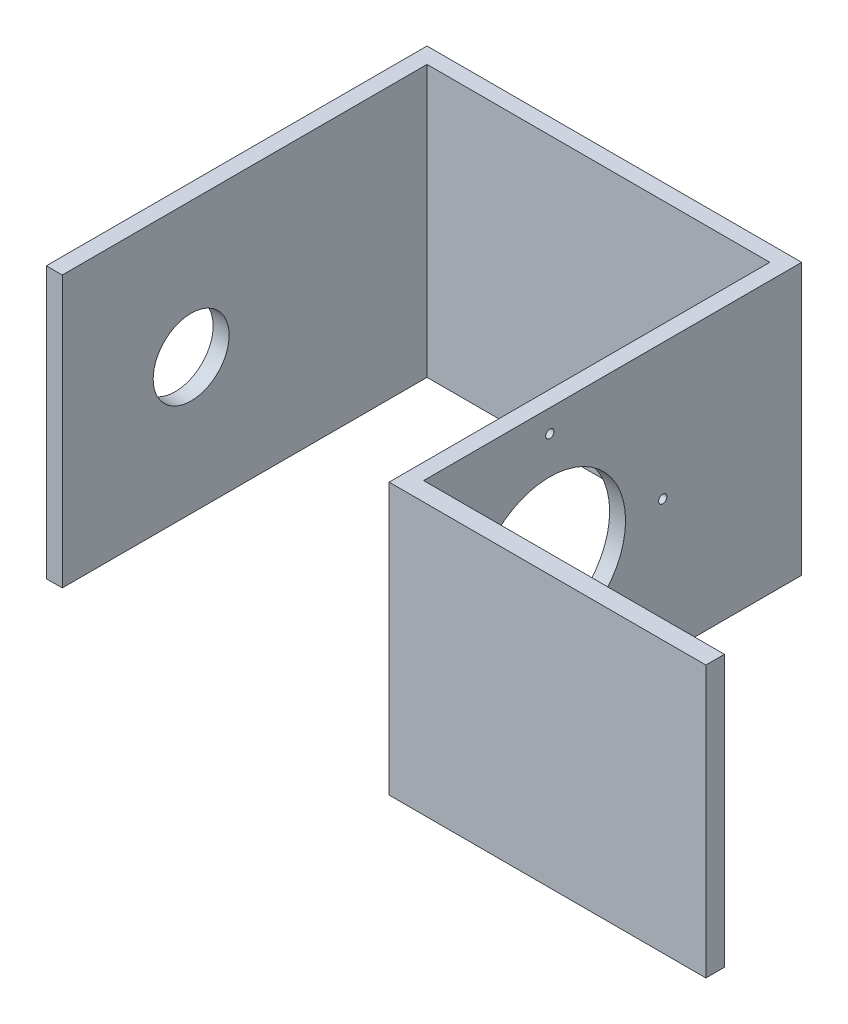
ISO-10303-21;
HEADER;
FILE_DESCRIPTION(('STEP AP214'),'2;1');
FILE_NAME('part.step','',(''),(''),'','','');
FILE_SCHEMA(('AUTOMOTIVE_DESIGN { 1 0 10303 214 1 1 1 1 }'));
ENDSEC;
DATA;
#1=APPLICATION_CONTEXT('core data for automotive mechanical design processes');
#2=APPLICATION_PROTOCOL_DEFINITION('international standard','automotive_design',2000,#1);
#3=PRODUCT_CONTEXT('',#1,'mechanical');
#4=PRODUCT('Part','Part','',(#3));
#5=PRODUCT_RELATED_PRODUCT_CATEGORY('part','',(#4));
#6=PRODUCT_DEFINITION_FORMATION('','',#4);
#7=PRODUCT_DEFINITION_CONTEXT('part definition',#1,'design');
#8=PRODUCT_DEFINITION('design','',#6,#7);
#9=PRODUCT_DEFINITION_SHAPE('','',#8);
#10=(LENGTH_UNIT() NAMED_UNIT(*) SI_UNIT(.MILLI.,.METRE.));
#11=(NAMED_UNIT(*) PLANE_ANGLE_UNIT() SI_UNIT($,.RADIAN.));
#12=(NAMED_UNIT(*) SI_UNIT($,.STERADIAN.) SOLID_ANGLE_UNIT());
#13=UNCERTAINTY_MEASURE_WITH_UNIT(LENGTH_MEASURE(1.E-05),#10,'distance_accuracy_value','');
#14=(GEOMETRIC_REPRESENTATION_CONTEXT(3) GLOBAL_UNCERTAINTY_ASSIGNED_CONTEXT((#13)) GLOBAL_UNIT_ASSIGNED_CONTEXT((#10,
#11,#12)) REPRESENTATION_CONTEXT('',''));
#15=CARTESIAN_POINT('',(0.,0.,0.));
#16=DIRECTION('',(0.,0.,1.));
#17=DIRECTION('',(1.,0.,0.));
#18=AXIS2_PLACEMENT_3D('',#15,#16,#17);
#19=CARTESIAN_POINT('',(183.723,51.,0.));
#20=DIRECTION('',(1.,0.,0.));
#21=DIRECTION('',(0.,0.,-1.));
#22=AXIS2_PLACEMENT_3D('',#19,#20,#21);
#23=PLANE('',#22);
#24=DIRECTION('',(0.,-1.,0.));
#25=VECTOR('',#24,1.);
#26=CARTESIAN_POINT('',(183.723,51.,54.5));
#27=LINE('',#26,#25);
#28=CARTESIAN_POINT('',(183.723,51.,54.5));
#29=VERTEX_POINT('',#28);
#30=CARTESIAN_POINT('',(183.723,-51.,54.5));
#31=VERTEX_POINT('',#30);
#32=EDGE_CURVE('E132',#29,#31,#27,.T.);
#33=ORIENTED_EDGE('',*,*,#32,.T.);
#34=DIRECTION('',(0.,0.,1.));
#35=VECTOR('',#34,1.);
#36=CARTESIAN_POINT('',(183.723,-51.,0.));
#37=LINE('',#36,#35);
#38=CARTESIAN_POINT('',(183.723,-51.,47.5));
#39=VERTEX_POINT('',#38);
#40=EDGE_CURVE('E131',#39,#31,#37,.T.);
#41=ORIENTED_EDGE('',*,*,#40,.F.);
#42=DIRECTION('',(0.,-1.,0.));
#43=VECTOR('',#42,1.);
#44=CARTESIAN_POINT('',(183.723,51.,47.5));
#45=LINE('',#44,#43);
#46=CARTESIAN_POINT('',(183.723,51.,47.5));
#47=VERTEX_POINT('',#46);
#48=EDGE_CURVE('E11',#47,#39,#45,.T.);
#49=ORIENTED_EDGE('',*,*,#48,.F.);
#50=DIRECTION('',(0.,0.,1.));
#51=VECTOR('',#50,1.);
#52=CARTESIAN_POINT('',(183.723,51.,0.));
#53=LINE('',#52,#51);
#54=EDGE_CURVE('E177',#47,#29,#53,.T.);
#55=ORIENTED_EDGE('',*,*,#54,.T.);
#56=EDGE_LOOP('',(#33,#41,#49,#55));
#57=FACE_BOUND('',#56,.T.);
#58=ADVANCED_FACE('F45',(#57),#23,.T.);
#59=CARTESIAN_POINT('',(0.,51.,47.5));
#60=DIRECTION('',(0.,0.,1.));
#61=DIRECTION('',(1.,0.,0.));
#62=AXIS2_PLACEMENT_3D('',#59,#60,#61);
#63=PLANE('',#62);
#64=ORIENTED_EDGE('',*,*,#48,.T.);
#65=DIRECTION('',(-1.,0.,0.));
#66=VECTOR('',#65,1.);
#67=CARTESIAN_POINT('',(0.,-51.,47.5));
#68=LINE('',#67,#66);
#69=CARTESIAN_POINT('',(70.5,-51.,47.5));
#70=VERTEX_POINT('',#69);
#71=EDGE_CURVE('E126',#39,#70,#68,.T.);
#72=ORIENTED_EDGE('',*,*,#71,.T.);
#73=DIRECTION('',(0.,-1.,0.));
#74=VECTOR('',#73,1.);
#75=CARTESIAN_POINT('',(70.5,51.,47.5));
#76=LINE('',#75,#74);
#77=CARTESIAN_POINT('',(70.5,51.,47.5));
#78=VERTEX_POINT('',#77);
#79=EDGE_CURVE('E53',#78,#70,#76,.T.);
#80=ORIENTED_EDGE('',*,*,#79,.F.);
#81=DIRECTION('',(-1.,0.,0.));
#82=VECTOR('',#81,1.);
#83=CARTESIAN_POINT('',(0.,51.,47.5));
#84=LINE('',#83,#82);
#85=EDGE_CURVE('E127',#47,#78,#84,.T.);
#86=ORIENTED_EDGE('',*,*,#85,.F.);
#87=EDGE_LOOP('',(#64,#72,#80,#86));
#88=FACE_BOUND('',#87,.T.);
#89=ADVANCED_FACE('F123',(#88),#63,.F.);
#90=CARTESIAN_POINT('',(70.5,51.,0.));
#91=DIRECTION('',(1.,0.,0.));
#92=DIRECTION('',(0.,0.,-1.));
#93=AXIS2_PLACEMENT_3D('',#90,#91,#92);
#94=PLANE('',#93);
#95=CARTESIAN_POINT('',(70.5,42.5,0.));
#96=DIRECTION('',(1.,0.,0.));
#97=DIRECTION('',(0.,0.,-1.));
#98=AXIS2_PLACEMENT_3D('',#95,#96,#97);
#99=CIRCLE('',#98,1.5635);
#100=CARTESIAN_POINT('',(70.5,42.5,-1.56350000000001));
#101=VERTEX_POINT('',#100);
#102=EDGE_CURVE('E423',#101,#101,#99,.T.);
#103=ORIENTED_EDGE('',*,*,#102,.F.);
#104=EDGE_LOOP('',(#103));
#105=FACE_BOUND('',#104,.T.);
#106=CARTESIAN_POINT('',(70.5,0.,42.5));
#107=DIRECTION('',(1.,0.,0.));
#108=DIRECTION('',(0.,0.,-1.));
#109=AXIS2_PLACEMENT_3D('',#106,#107,#108);
#110=CIRCLE('',#109,1.5635);
#111=CARTESIAN_POINT('',(70.5,0.,40.9365));
#112=VERTEX_POINT('',#111);
#113=EDGE_CURVE('E428',#112,#112,#110,.T.);
#114=ORIENTED_EDGE('',*,*,#113,.F.);
#115=EDGE_LOOP('',(#114));
#116=FACE_BOUND('',#115,.T.);
#117=CARTESIAN_POINT('',(70.5,-42.5,0.));
#118=DIRECTION('',(1.,0.,0.));
#119=DIRECTION('',(0.,0.,-1.));
#120=AXIS2_PLACEMENT_3D('',#117,#118,#119);
#121=CIRCLE('',#120,1.5635);
#122=CARTESIAN_POINT('',(70.5,-42.5,-1.56350000000001));
#123=VERTEX_POINT('',#122);
#124=EDGE_CURVE('E433',#123,#123,#121,.T.);
#125=ORIENTED_EDGE('',*,*,#124,.F.);
#126=EDGE_LOOP('',(#125));
#127=FACE_BOUND('',#126,.T.);
#128=CARTESIAN_POINT('',(70.5,0.,-42.5));
#129=DIRECTION('',(1.,0.,0.));
#130=DIRECTION('',(0.,0.,-1.));
#131=AXIS2_PLACEMENT_3D('',#128,#129,#130);
#132=CIRCLE('',#131,1.5635);
#133=CARTESIAN_POINT('',(70.5,0.,-44.0635));
#134=VERTEX_POINT('',#133);
#135=EDGE_CURVE('E419',#134,#134,#132,.T.);
#136=ORIENTED_EDGE('',*,*,#135,.F.);
#137=EDGE_LOOP('',(#136));
#138=FACE_BOUND('',#137,.T.);
#139=CARTESIAN_POINT('',(70.5,0.,0.));
#140=DIRECTION('',(1.,0.,0.));
#141=DIRECTION('',(0.,0.,-1.));
#142=AXIS2_PLACEMENT_3D('',#139,#140,#141);
#143=CIRCLE('',#142,28.5);
#144=CARTESIAN_POINT('',(70.5,0.,-28.5));
#145=VERTEX_POINT('',#144);
#146=EDGE_CURVE('E413',#145,#145,#143,.T.);
#147=ORIENTED_EDGE('',*,*,#146,.F.);
#148=EDGE_LOOP('',(#147));
#149=FACE_BOUND('',#148,.T.);
#150=ORIENTED_EDGE('',*,*,#79,.T.);
#151=DIRECTION('',(0.,0.,1.));
#152=VECTOR('',#151,1.);
#153=CARTESIAN_POINT('',(70.5,-51.,0.));
#154=LINE('',#153,#152);
#155=CARTESIAN_POINT('',(70.5,-51.,-94.7730618060092));
#156=VERTEX_POINT('',#155);
#157=EDGE_CURVE('E143',#156,#70,#154,.T.);
#158=ORIENTED_EDGE('',*,*,#157,.F.);
#159=DIRECTION('',(0.,-1.,0.));
#160=VECTOR('',#159,1.);
#161=CARTESIAN_POINT('',(70.5,51.,-94.7730618060092));
#162=LINE('',#161,#160);
#163=CARTESIAN_POINT('',(70.5,51.,-94.7730618060092));
#164=VERTEX_POINT('',#163);
#165=EDGE_CURVE('E229',#164,#156,#162,.T.);
#166=ORIENTED_EDGE('',*,*,#165,.F.);
#167=DIRECTION('',(0.,0.,1.));
#168=VECTOR('',#167,1.);
#169=CARTESIAN_POINT('',(70.5,51.,0.));
#170=LINE('',#169,#168);
#171=EDGE_CURVE('E182',#164,#78,#170,.T.);
#172=ORIENTED_EDGE('',*,*,#171,.T.);
#173=EDGE_LOOP('',(#150,#158,#166,#172));
#174=FACE_BOUND('',#173,.T.);
#175=ADVANCED_FACE('F233',(#105,#116,#127,#138,#149,#174),#94,.T.);
#176=CARTESIAN_POINT('',(0.,51.,-94.7730618060092));
#177=DIRECTION('',(0.,0.,1.));
#178=DIRECTION('',(1.,0.,0.));
#179=AXIS2_PLACEMENT_3D('',#176,#177,#178);
#180=PLANE('',#179);
#181=ORIENTED_EDGE('',*,*,#165,.T.);
#182=DIRECTION('',(-1.,0.,0.));
#183=VECTOR('',#182,1.);
#184=CARTESIAN_POINT('',(0.,-51.,-94.7730618060092));
#185=LINE('',#184,#183);
#186=CARTESIAN_POINT('',(-70.5,-51.,-94.7730618060092));
#187=VERTEX_POINT('',#186);
#188=EDGE_CURVE('E147',#156,#187,#185,.T.);
#189=ORIENTED_EDGE('',*,*,#188,.T.);
#190=DIRECTION('',(0.,-1.,0.));
#191=VECTOR('',#190,1.);
#192=CARTESIAN_POINT('',(-70.5,51.,-94.7730618060092));
#193=LINE('',#192,#191);
#194=CARTESIAN_POINT('',(-70.5,51.,-94.7730618060092));
#195=VERTEX_POINT('',#194);
#196=EDGE_CURVE('E226',#195,#187,#193,.T.);
#197=ORIENTED_EDGE('',*,*,#196,.F.);
#198=DIRECTION('',(-1.,0.,0.));
#199=VECTOR('',#198,1.);
#200=CARTESIAN_POINT('',(0.,51.,-94.7730618060092));
#201=LINE('',#200,#199);
#202=EDGE_CURVE('E186',#164,#195,#201,.T.);
#203=ORIENTED_EDGE('',*,*,#202,.F.);
#204=EDGE_LOOP('',(#181,#189,#197,#203));
#205=FACE_BOUND('',#204,.T.);
#206=ADVANCED_FACE('F241',(#205),#180,.F.);
#207=CARTESIAN_POINT('',(-70.5,51.,0.));
#208=DIRECTION('',(-1.,0.,0.));
#209=DIRECTION('',(0.,0.,1.));
#210=AXIS2_PLACEMENT_3D('',#207,#208,#209);
#211=PLANE('',#210);
#212=CARTESIAN_POINT('',(-70.5,0.,0.));
#213=DIRECTION('',(-1.,0.,0.));
#214=DIRECTION('',(0.,0.,1.));
#215=AXIS2_PLACEMENT_3D('',#212,#213,#214);
#216=CIRCLE('',#215,14.2875);
#217=CARTESIAN_POINT('',(-70.5,0.,14.2875));
#218=VERTEX_POINT('',#217);
#219=EDGE_CURVE('E448',#218,#218,#216,.T.);
#220=ORIENTED_EDGE('',*,*,#219,.F.);
#221=EDGE_LOOP('',(#220));
#222=FACE_BOUND('',#221,.T.);
#223=ORIENTED_EDGE('',*,*,#196,.T.);
#224=DIRECTION('',(0.,0.,-1.));
#225=VECTOR('',#224,1.);
#226=CARTESIAN_POINT('',(-70.5,-51.,0.));
#227=LINE('',#226,#225);
#228=CARTESIAN_POINT('',(-70.5,-51.,48.5));
#229=VERTEX_POINT('',#228);
#230=EDGE_CURVE('E154',#229,#187,#227,.T.);
#231=ORIENTED_EDGE('',*,*,#230,.F.);
#232=DIRECTION('',(0.,-1.,0.));
#233=VECTOR('',#232,1.);
#234=CARTESIAN_POINT('',(-70.5,51.,48.5));
#235=LINE('',#234,#233);
#236=CARTESIAN_POINT('',(-70.5,51.,48.5));
#237=VERTEX_POINT('',#236);
#238=EDGE_CURVE('E223',#237,#229,#235,.T.);
#239=ORIENTED_EDGE('',*,*,#238,.F.);
#240=DIRECTION('',(0.,0.,-1.));
#241=VECTOR('',#240,1.);
#242=CARTESIAN_POINT('',(-70.5,51.,0.));
#243=LINE('',#242,#241);
#244=EDGE_CURVE('E189',#237,#195,#243,.T.);
#245=ORIENTED_EDGE('',*,*,#244,.T.);
#246=EDGE_LOOP('',(#223,#231,#239,#245));
#247=FACE_BOUND('',#246,.T.);
#248=ADVANCED_FACE('F244',(#222,#247),#211,.T.);
#249=CARTESIAN_POINT('',(0.,51.,48.5));
#250=DIRECTION('',(0.,0.,1.));
#251=DIRECTION('',(1.,0.,0.));
#252=AXIS2_PLACEMENT_3D('',#249,#250,#251);
#253=PLANE('',#252);
#254=ORIENTED_EDGE('',*,*,#238,.T.);
#255=DIRECTION('',(-1.,0.,0.));
#256=VECTOR('',#255,1.);
#257=CARTESIAN_POINT('',(0.,-51.,48.5));
#258=LINE('',#257,#256);
#259=CARTESIAN_POINT('',(-64.5,-51.,48.5));
#260=VERTEX_POINT('',#259);
#261=EDGE_CURVE('E158',#260,#229,#258,.T.);
#262=ORIENTED_EDGE('',*,*,#261,.F.);
#263=DIRECTION('',(0.,-1.,0.));
#264=VECTOR('',#263,1.);
#265=CARTESIAN_POINT('',(-64.5,51.,48.5));
#266=LINE('',#265,#264);
#267=CARTESIAN_POINT('',(-64.5,51.,48.5));
#268=VERTEX_POINT('',#267);
#269=EDGE_CURVE('E220',#268,#260,#266,.T.);
#270=ORIENTED_EDGE('',*,*,#269,.F.);
#271=DIRECTION('',(-1.,0.,0.));
#272=VECTOR('',#271,1.);
#273=CARTESIAN_POINT('',(0.,51.,48.5));
#274=LINE('',#273,#272);
#275=EDGE_CURVE('E193',#268,#237,#274,.T.);
#276=ORIENTED_EDGE('',*,*,#275,.T.);
#277=EDGE_LOOP('',(#254,#262,#270,#276));
#278=FACE_BOUND('',#277,.T.);
#279=ADVANCED_FACE('F247',(#278),#253,.T.);
#280=CARTESIAN_POINT('',(-64.5,51.,0.));
#281=DIRECTION('',(1.,0.,0.));
#282=DIRECTION('',(0.,0.,-1.));
#283=AXIS2_PLACEMENT_3D('',#280,#281,#282);
#284=PLANE('',#283);
#285=CARTESIAN_POINT('',(-64.5,0.,0.));
#286=DIRECTION('',(1.,0.,0.));
#287=DIRECTION('',(0.,0.,-1.));
#288=AXIS2_PLACEMENT_3D('',#285,#286,#287);
#289=CIRCLE('',#288,14.2875);
#290=CARTESIAN_POINT('',(-64.5,0.,-14.2875));
#291=VERTEX_POINT('',#290);
#292=EDGE_CURVE('E455',#291,#291,#289,.F.);
#293=ORIENTED_EDGE('',*,*,#292,.T.);
#294=EDGE_LOOP('',(#293));
#295=FACE_BOUND('',#294,.T.);
#296=ORIENTED_EDGE('',*,*,#269,.T.);
#297=DIRECTION('',(0.,0.,1.));
#298=VECTOR('',#297,1.);
#299=CARTESIAN_POINT('',(-64.5,-51.,0.));
#300=LINE('',#299,#298);
#301=CARTESIAN_POINT('',(-64.5,-51.,-88.7730618060092));
#302=VERTEX_POINT('',#301);
#303=EDGE_CURVE('E162',#302,#260,#300,.T.);
#304=ORIENTED_EDGE('',*,*,#303,.F.);
#305=DIRECTION('',(0.,-1.,0.));
#306=VECTOR('',#305,1.);
#307=CARTESIAN_POINT('',(-64.5,51.,-88.7730618060092));
#308=LINE('',#307,#306);
#309=CARTESIAN_POINT('',(-64.5,51.,-88.7730618060092));
#310=VERTEX_POINT('',#309);
#311=EDGE_CURVE('E217',#310,#302,#308,.T.);
#312=ORIENTED_EDGE('',*,*,#311,.F.);
#313=DIRECTION('',(0.,0.,1.));
#314=VECTOR('',#313,1.);
#315=CARTESIAN_POINT('',(-64.5,51.,0.));
#316=LINE('',#315,#314);
#317=EDGE_CURVE('E197',#310,#268,#316,.T.);
#318=ORIENTED_EDGE('',*,*,#317,.T.);
#319=EDGE_LOOP('',(#296,#304,#312,#318));
#320=FACE_BOUND('',#319,.T.);
#321=ADVANCED_FACE('F252',(#295,#320),#284,.T.);
#322=CARTESIAN_POINT('',(0.,51.,-88.7730618060092));
#323=DIRECTION('',(0.,0.,1.));
#324=DIRECTION('',(1.,0.,0.));
#325=AXIS2_PLACEMENT_3D('',#322,#323,#324);
#326=PLANE('',#325);
#327=ORIENTED_EDGE('',*,*,#311,.T.);
#328=DIRECTION('',(-1.,0.,0.));
#329=VECTOR('',#328,1.);
#330=CARTESIAN_POINT('',(0.,-51.,-88.7730618060092));
#331=LINE('',#330,#329);
#332=CARTESIAN_POINT('',(64.5,-51.,-88.7730618060092));
#333=VERTEX_POINT('',#332);
#334=EDGE_CURVE('E166',#333,#302,#331,.T.);
#335=ORIENTED_EDGE('',*,*,#334,.F.);
#336=DIRECTION('',(0.,-1.,0.));
#337=VECTOR('',#336,1.);
#338=CARTESIAN_POINT('',(64.5,51.,-88.7730618060092));
#339=LINE('',#338,#337);
#340=CARTESIAN_POINT('',(64.5,51.,-88.7730618060092));
#341=VERTEX_POINT('',#340);
#342=EDGE_CURVE('E214',#341,#333,#339,.T.);
#343=ORIENTED_EDGE('',*,*,#342,.F.);
#344=DIRECTION('',(-1.,0.,0.));
#345=VECTOR('',#344,1.);
#346=CARTESIAN_POINT('',(0.,51.,-88.7730618060092));
#347=LINE('',#346,#345);
#348=EDGE_CURVE('E201',#341,#310,#347,.T.);
#349=ORIENTED_EDGE('',*,*,#348,.T.);
#350=EDGE_LOOP('',(#327,#335,#343,#349));
#351=FACE_BOUND('',#350,.T.);
#352=ADVANCED_FACE('F255',(#351),#326,.T.);
#353=CARTESIAN_POINT('',(64.5,51.,0.));
#354=DIRECTION('',(1.,0.,0.));
#355=DIRECTION('',(0.,0.,-1.));
#356=AXIS2_PLACEMENT_3D('',#353,#354,#355);
#357=PLANE('',#356);
#358=CARTESIAN_POINT('',(64.5,42.5,0.));
#359=DIRECTION('',(1.,0.,0.));
#360=DIRECTION('',(0.,0.,-1.));
#361=AXIS2_PLACEMENT_3D('',#358,#359,#360);
#362=CIRCLE('',#361,1.5635);
#363=CARTESIAN_POINT('',(64.5,42.5,-1.56350000000001));
#364=VERTEX_POINT('',#363);
#365=EDGE_CURVE('E137',#364,#364,#362,.F.);
#366=ORIENTED_EDGE('',*,*,#365,.F.);
#367=EDGE_LOOP('',(#366));
#368=FACE_BOUND('',#367,.T.);
#369=CARTESIAN_POINT('',(64.5,0.,42.5));
#370=DIRECTION('',(1.,0.,0.));
#371=DIRECTION('',(0.,0.,-1.));
#372=AXIS2_PLACEMENT_3D('',#369,#370,#371);
#373=CIRCLE('',#372,1.5635);
#374=CARTESIAN_POINT('',(64.5,0.,40.9365));
#375=VERTEX_POINT('',#374);
#376=EDGE_CURVE('E445',#375,#375,#373,.F.);
#377=ORIENTED_EDGE('',*,*,#376,.F.);
#378=EDGE_LOOP('',(#377));
#379=FACE_BOUND('',#378,.T.);
#380=CARTESIAN_POINT('',(64.5,-42.5,0.));
#381=DIRECTION('',(1.,0.,0.));
#382=DIRECTION('',(0.,0.,-1.));
#383=AXIS2_PLACEMENT_3D('',#380,#381,#382);
#384=CIRCLE('',#383,1.5635);
#385=CARTESIAN_POINT('',(64.5,-42.5,-1.56350000000001));
#386=VERTEX_POINT('',#385);
#387=EDGE_CURVE('E438',#386,#386,#384,.F.);
#388=ORIENTED_EDGE('',*,*,#387,.F.);
#389=EDGE_LOOP('',(#388));
#390=FACE_BOUND('',#389,.T.);
#391=CARTESIAN_POINT('',(64.5,0.,-42.5));
#392=DIRECTION('',(1.,0.,0.));
#393=DIRECTION('',(0.,0.,-1.));
#394=AXIS2_PLACEMENT_3D('',#391,#392,#393);
#395=CIRCLE('',#394,1.5635);
#396=CARTESIAN_POINT('',(64.5,0.,-44.0635));
#397=VERTEX_POINT('',#396);
#398=EDGE_CURVE('E426',#397,#397,#395,.F.);
#399=ORIENTED_EDGE('',*,*,#398,.F.);
#400=EDGE_LOOP('',(#399));
#401=FACE_BOUND('',#400,.T.);
#402=CARTESIAN_POINT('',(64.5,0.,0.));
#403=DIRECTION('',(1.,0.,0.));
#404=DIRECTION('',(0.,0.,-1.));
#405=AXIS2_PLACEMENT_3D('',#402,#403,#404);
#406=CIRCLE('',#405,28.5);
#407=CARTESIAN_POINT('',(64.5,0.,-28.5));
#408=VERTEX_POINT('',#407);
#409=EDGE_CURVE('E416',#408,#408,#406,.F.);
#410=ORIENTED_EDGE('',*,*,#409,.F.);
#411=EDGE_LOOP('',(#410));
#412=FACE_BOUND('',#411,.T.);
#413=ORIENTED_EDGE('',*,*,#342,.T.);
#414=DIRECTION('',(0.,0.,1.));
#415=VECTOR('',#414,1.);
#416=CARTESIAN_POINT('',(64.5,-51.,0.));
#417=LINE('',#416,#415);
#418=CARTESIAN_POINT('',(64.5,-51.,54.5));
#419=VERTEX_POINT('',#418);
#420=EDGE_CURVE('E170',#333,#419,#417,.T.);
#421=ORIENTED_EDGE('',*,*,#420,.T.);
#422=DIRECTION('',(0.,-1.,0.));
#423=VECTOR('',#422,1.);
#424=CARTESIAN_POINT('',(64.5,51.,54.5));
#425=LINE('',#424,#423);
#426=CARTESIAN_POINT('',(64.5,51.,54.5));
#427=VERTEX_POINT('',#426);
#428=EDGE_CURVE('E211',#427,#419,#425,.T.);
#429=ORIENTED_EDGE('',*,*,#428,.F.);
#430=DIRECTION('',(0.,0.,1.));
#431=VECTOR('',#430,1.);
#432=CARTESIAN_POINT('',(64.5,51.,0.));
#433=LINE('',#432,#431);
#434=EDGE_CURVE('E65',#341,#427,#433,.T.);
#435=ORIENTED_EDGE('',*,*,#434,.F.);
#436=EDGE_LOOP('',(#413,#421,#429,#435));
#437=FACE_BOUND('',#436,.T.);
#438=ADVANCED_FACE('F257',(#368,#379,#390,#401,#412,#437),#357,.F.);
#439=CARTESIAN_POINT('',(0.,51.,54.5));
#440=DIRECTION('',(0.,0.,-1.));
#441=DIRECTION('',(-1.,0.,0.));
#442=AXIS2_PLACEMENT_3D('',#439,#440,#441);
#443=PLANE('',#442);
#444=ORIENTED_EDGE('',*,*,#428,.T.);
#445=DIRECTION('',(1.,0.,0.));
#446=VECTOR('',#445,1.);
#447=CARTESIAN_POINT('',(0.,-51.,54.5));
#448=LINE('',#447,#446);
#449=EDGE_CURVE('E174',#419,#31,#448,.T.);
#450=ORIENTED_EDGE('',*,*,#449,.T.);
#451=ORIENTED_EDGE('',*,*,#32,.F.);
#452=DIRECTION('',(1.,0.,0.));
#453=VECTOR('',#452,1.);
#454=CARTESIAN_POINT('',(0.,51.,54.5));
#455=LINE('',#454,#453);
#456=EDGE_CURVE('E60',#427,#29,#455,.T.);
#457=ORIENTED_EDGE('',*,*,#456,.F.);
#458=EDGE_LOOP('',(#444,#450,#451,#457));
#459=FACE_BOUND('',#458,.T.);
#460=ADVANCED_FACE('F259',(#459),#443,.F.);
#461=CARTESIAN_POINT('',(0.,51.,0.));
#462=DIRECTION('',(0.,1.,0.));
#463=DIRECTION('',(0.,0.,1.));
#464=AXIS2_PLACEMENT_3D('',#461,#462,#463);
#465=PLANE('',#464);
#466=ORIENTED_EDGE('',*,*,#54,.F.);
#467=ORIENTED_EDGE('',*,*,#85,.T.);
#468=ORIENTED_EDGE('',*,*,#171,.F.);
#469=ORIENTED_EDGE('',*,*,#202,.T.);
#470=ORIENTED_EDGE('',*,*,#244,.F.);
#471=ORIENTED_EDGE('',*,*,#275,.F.);
#472=ORIENTED_EDGE('',*,*,#317,.F.);
#473=ORIENTED_EDGE('',*,*,#348,.F.);
#474=ORIENTED_EDGE('',*,*,#434,.T.);
#475=ORIENTED_EDGE('',*,*,#456,.T.);
#476=EDGE_LOOP('',(#466,#467,#468,#469,#470,#471,#472,#473,#474,#475));
#477=FACE_BOUND('',#476,.T.);
#478=ADVANCED_FACE('F236',(#477),#465,.T.);
#479=CARTESIAN_POINT('',(0.,-51.,0.));
#480=DIRECTION('',(0.,1.,0.));
#481=DIRECTION('',(0.,0.,1.));
#482=AXIS2_PLACEMENT_3D('',#479,#480,#481);
#483=PLANE('',#482);
#484=ORIENTED_EDGE('',*,*,#40,.T.);
#485=ORIENTED_EDGE('',*,*,#449,.F.);
#486=ORIENTED_EDGE('',*,*,#420,.F.);
#487=ORIENTED_EDGE('',*,*,#334,.T.);
#488=ORIENTED_EDGE('',*,*,#303,.T.);
#489=ORIENTED_EDGE('',*,*,#261,.T.);
#490=ORIENTED_EDGE('',*,*,#230,.T.);
#491=ORIENTED_EDGE('',*,*,#188,.F.);
#492=ORIENTED_EDGE('',*,*,#157,.T.);
#493=ORIENTED_EDGE('',*,*,#71,.F.);
#494=EDGE_LOOP('',(#484,#485,#486,#487,#488,#489,#490,#491,#492,#493));
#495=FACE_BOUND('',#494,.T.);
#496=ADVANCED_FACE('F140',(#495),#483,.F.);
#497=CARTESIAN_POINT('',(-70.501,0.,0.));
#498=DIRECTION('',(1.,0.,0.));
#499=DIRECTION('',(0.,0.,-1.));
#500=AXIS2_PLACEMENT_3D('',#497,#498,#499);
#501=CYLINDRICAL_SURFACE('',#500,28.5);
#502=ORIENTED_EDGE('',*,*,#146,.T.);
#503=EDGE_LOOP('',(#502));
#504=FACE_BOUND('',#503,.T.);
#505=ORIENTED_EDGE('',*,*,#409,.T.);
#506=EDGE_LOOP('',(#505));
#507=FACE_BOUND('',#506,.T.);
#508=ADVANCED_FACE('F370',(#504,#507),#501,.F.);
#509=CARTESIAN_POINT('',(-70.501,0.,-42.5));
#510=DIRECTION('',(1.,0.,0.));
#511=DIRECTION('',(0.,0.,-1.));
#512=AXIS2_PLACEMENT_3D('',#509,#510,#511);
#513=CYLINDRICAL_SURFACE('',#512,1.5635);
#514=ORIENTED_EDGE('',*,*,#135,.T.);
#515=EDGE_LOOP('',(#514));
#516=FACE_BOUND('',#515,.T.);
#517=ORIENTED_EDGE('',*,*,#398,.T.);
#518=EDGE_LOOP('',(#517));
#519=FACE_BOUND('',#518,.T.);
#520=ADVANCED_FACE('F360',(#516,#519),#513,.F.);
#521=CARTESIAN_POINT('',(-70.501,-42.5,0.));
#522=DIRECTION('',(1.,0.,0.));
#523=DIRECTION('',(0.,0.,-1.));
#524=AXIS2_PLACEMENT_3D('',#521,#522,#523);
#525=CYLINDRICAL_SURFACE('',#524,1.5635);
#526=ORIENTED_EDGE('',*,*,#124,.T.);
#527=EDGE_LOOP('',(#526));
#528=FACE_BOUND('',#527,.T.);
#529=ORIENTED_EDGE('',*,*,#387,.T.);
#530=EDGE_LOOP('',(#529));
#531=FACE_BOUND('',#530,.T.);
#532=ADVANCED_FACE('F350',(#528,#531),#525,.F.);
#533=CARTESIAN_POINT('',(-70.501,0.,42.5));
#534=DIRECTION('',(1.,0.,0.));
#535=DIRECTION('',(0.,0.,-1.));
#536=AXIS2_PLACEMENT_3D('',#533,#534,#535);
#537=CYLINDRICAL_SURFACE('',#536,1.5635);
#538=ORIENTED_EDGE('',*,*,#113,.T.);
#539=EDGE_LOOP('',(#538));
#540=FACE_BOUND('',#539,.T.);
#541=ORIENTED_EDGE('',*,*,#376,.T.);
#542=EDGE_LOOP('',(#541));
#543=FACE_BOUND('',#542,.T.);
#544=ADVANCED_FACE('F342',(#540,#543),#537,.F.);
#545=CARTESIAN_POINT('',(-70.501,42.5,0.));
#546=DIRECTION('',(1.,0.,0.));
#547=DIRECTION('',(0.,0.,-1.));
#548=AXIS2_PLACEMENT_3D('',#545,#546,#547);
#549=CYLINDRICAL_SURFACE('',#548,1.5635);
#550=ORIENTED_EDGE('',*,*,#102,.T.);
#551=EDGE_LOOP('',(#550));
#552=FACE_BOUND('',#551,.T.);
#553=ORIENTED_EDGE('',*,*,#365,.T.);
#554=EDGE_LOOP('',(#553));
#555=FACE_BOUND('',#554,.T.);
#556=ADVANCED_FACE('F320',(#552,#555),#549,.F.);
#557=CARTESIAN_POINT('',(183.724,0.,0.));
#558=DIRECTION('',(-1.,0.,0.));
#559=DIRECTION('',(0.,0.,1.));
#560=AXIS2_PLACEMENT_3D('',#557,#558,#559);
#561=CYLINDRICAL_SURFACE('',#560,14.2875);
#562=ORIENTED_EDGE('',*,*,#292,.F.);
#563=EDGE_LOOP('',(#562));
#564=FACE_BOUND('',#563,.T.);
#565=ORIENTED_EDGE('',*,*,#219,.T.);
#566=EDGE_LOOP('',(#565));
#567=FACE_BOUND('',#566,.T.);
#568=ADVANCED_FACE('F329',(#564,#567),#561,.F.);
#569=CLOSED_SHELL('',(#58,#89,#175,#206,#248,#279,#321,#352,#438,#460,#478,#496,#508,#520,#532,
#544,#556,#568));
#570=MANIFOLD_SOLID_BREP('B2',#569);
#571=ADVANCED_BREP_SHAPE_REPRESENTATION('',(#18,#570),#14);
#572=SHAPE_DEFINITION_REPRESENTATION(#9,#571);
ENDSEC;
END-ISO-10303-21;
